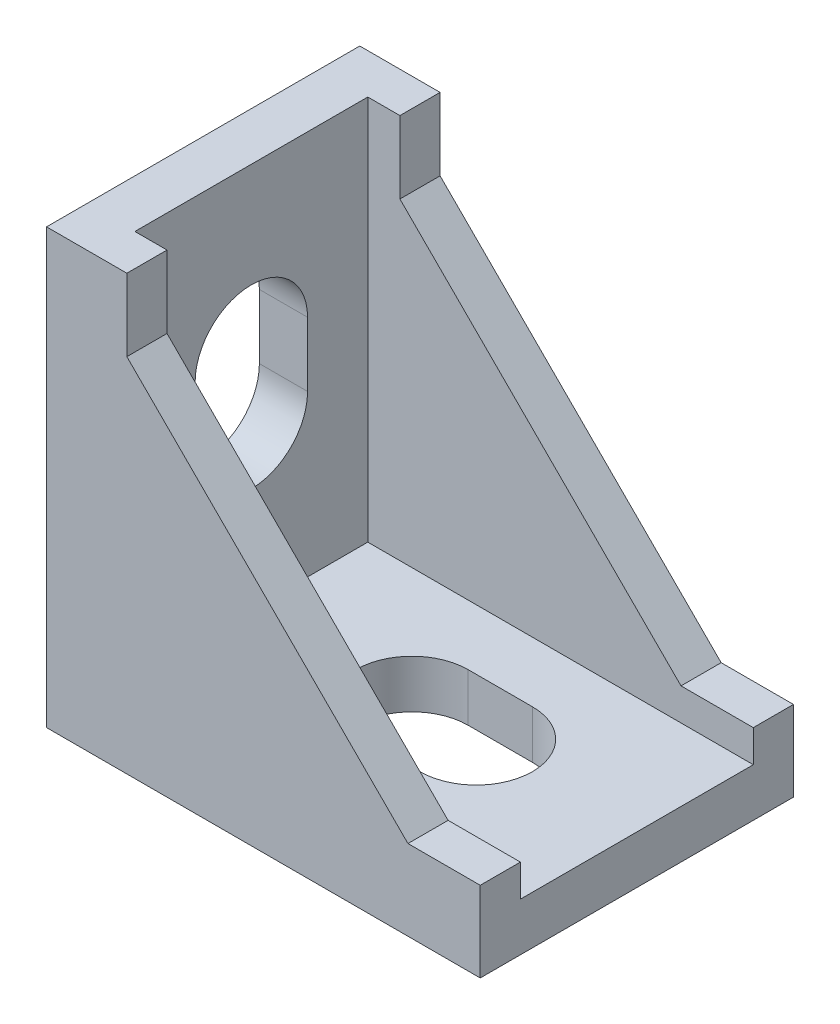
ISO-10303-21;
HEADER;
FILE_DESCRIPTION(('STEP AP214'),'2;1');
FILE_NAME('part.step','',(''),(''),'','','');
FILE_SCHEMA(('AUTOMOTIVE_DESIGN { 1 0 10303 214 1 1 1 1 }'));
ENDSEC;
DATA;
#1=APPLICATION_CONTEXT('core data for automotive mechanical design processes');
#2=APPLICATION_PROTOCOL_DEFINITION('international standard','automotive_design',2000,#1);
#3=PRODUCT_CONTEXT('',#1,'mechanical');
#4=PRODUCT('Part','Part','',(#3));
#5=PRODUCT_RELATED_PRODUCT_CATEGORY('part','',(#4));
#6=PRODUCT_DEFINITION_FORMATION('','',#4);
#7=PRODUCT_DEFINITION_CONTEXT('part definition',#1,'design');
#8=PRODUCT_DEFINITION('design','',#6,#7);
#9=PRODUCT_DEFINITION_SHAPE('','',#8);
#10=(LENGTH_UNIT() NAMED_UNIT(*) SI_UNIT(.MILLI.,.METRE.));
#11=(NAMED_UNIT(*) PLANE_ANGLE_UNIT() SI_UNIT($,.RADIAN.));
#12=(NAMED_UNIT(*) SI_UNIT($,.STERADIAN.) SOLID_ANGLE_UNIT());
#13=UNCERTAINTY_MEASURE_WITH_UNIT(LENGTH_MEASURE(1.E-05),#10,'distance_accuracy_value','');
#14=(GEOMETRIC_REPRESENTATION_CONTEXT(3) GLOBAL_UNCERTAINTY_ASSIGNED_CONTEXT((#13)) GLOBAL_UNIT_ASSIGNED_CONTEXT((#10,
#11,#12)) REPRESENTATION_CONTEXT('',''));
#15=CARTESIAN_POINT('',(0.,0.,0.));
#16=DIRECTION('',(0.,0.,1.));
#17=DIRECTION('',(1.,0.,0.));
#18=AXIS2_PLACEMENT_3D('',#15,#16,#17);
#19=CARTESIAN_POINT('',(27.,5.,19.5));
#20=DIRECTION('',(-1.,0.,0.));
#21=DIRECTION('',(0.,0.,1.));
#22=AXIS2_PLACEMENT_3D('',#19,#20,#21);
#23=PLANE('',#22);
#24=DIRECTION('',(0.,1.,0.));
#25=VECTOR('',#24,1.);
#26=CARTESIAN_POINT('',(27.,3.,2.5));
#27=LINE('',#26,#25);
#28=CARTESIAN_POINT('',(27.,3.,2.5));
#29=VERTEX_POINT('',#28);
#30=CARTESIAN_POINT('',(27.,5.,2.5));
#31=VERTEX_POINT('',#30);
#32=EDGE_CURVE('E264',#29,#31,#27,.T.);
#33=ORIENTED_EDGE('',*,*,#32,.F.);
#34=DIRECTION('',(0.,0.,1.));
#35=VECTOR('',#34,1.);
#36=CARTESIAN_POINT('',(27.,3.,2.5));
#37=LINE('',#36,#35);
#38=CARTESIAN_POINT('',(27.,3.,17.));
#39=VERTEX_POINT('',#38);
#40=EDGE_CURVE('E299',#29,#39,#37,.T.);
#41=ORIENTED_EDGE('',*,*,#40,.T.);
#42=DIRECTION('',(0.,1.,0.));
#43=VECTOR('',#42,1.);
#44=CARTESIAN_POINT('',(27.,3.,17.));
#45=LINE('',#44,#43);
#46=CARTESIAN_POINT('',(27.,5.,17.));
#47=VERTEX_POINT('',#46);
#48=EDGE_CURVE('E281',#39,#47,#45,.T.);
#49=ORIENTED_EDGE('',*,*,#48,.T.);
#50=DIRECTION('',(0.,0.,-1.));
#51=VECTOR('',#50,1.);
#52=CARTESIAN_POINT('',(27.,5.,19.5));
#53=LINE('',#52,#51);
#54=CARTESIAN_POINT('',(27.,5.,19.5));
#55=VERTEX_POINT('',#54);
#56=EDGE_CURVE('E47',#55,#47,#53,.T.);
#57=ORIENTED_EDGE('',*,*,#56,.F.);
#58=DIRECTION('',(0.,1.,0.));
#59=VECTOR('',#58,1.);
#60=CARTESIAN_POINT('',(27.,5.,19.5));
#61=LINE('',#60,#59);
#62=CARTESIAN_POINT('',(27.,0.,19.5));
#63=VERTEX_POINT('',#62);
#64=EDGE_CURVE('E306',#63,#55,#61,.T.);
#65=ORIENTED_EDGE('',*,*,#64,.F.);
#66=DIRECTION('',(0.,0.,-1.));
#67=VECTOR('',#66,1.);
#68=CARTESIAN_POINT('',(27.,0.,19.5));
#69=LINE('',#68,#67);
#70=CARTESIAN_POINT('',(27.,0.,0.));
#71=VERTEX_POINT('',#70);
#72=EDGE_CURVE('E11',#63,#71,#69,.T.);
#73=ORIENTED_EDGE('',*,*,#72,.T.);
#74=DIRECTION('',(0.,1.,0.));
#75=VECTOR('',#74,1.);
#76=CARTESIAN_POINT('',(27.,5.,0.));
#77=LINE('',#76,#75);
#78=CARTESIAN_POINT('',(27.,5.,0.));
#79=VERTEX_POINT('',#78);
#80=EDGE_CURVE('E322',#71,#79,#77,.T.);
#81=ORIENTED_EDGE('',*,*,#80,.T.);
#82=EDGE_CURVE('E353',#31,#79,#53,.T.);
#83=ORIENTED_EDGE('',*,*,#82,.F.);
#84=EDGE_LOOP('',(#33,#41,#49,#57,#65,#73,#81,#83));
#85=FACE_BOUND('',#84,.T.);
#86=ADVANCED_FACE('F39',(#85),#23,.F.);
#87=CARTESIAN_POINT('',(22.5,5.,19.5));
#88=DIRECTION('',(0.,-1.,0.));
#89=DIRECTION('',(0.,0.,-1.));
#90=AXIS2_PLACEMENT_3D('',#87,#88,#89);
#91=PLANE('',#90);
#92=DIRECTION('',(-1.,0.,0.));
#93=VECTOR('',#92,1.);
#94=CARTESIAN_POINT('',(22.5,5.,2.5));
#95=LINE('',#94,#93);
#96=CARTESIAN_POINT('',(22.5,5.,2.5));
#97=VERTEX_POINT('',#96);
#98=EDGE_CURVE('E266',#31,#97,#95,.T.);
#99=ORIENTED_EDGE('',*,*,#98,.F.);
#100=ORIENTED_EDGE('',*,*,#82,.T.);
#101=DIRECTION('',(-1.,0.,0.));
#102=VECTOR('',#101,1.);
#103=CARTESIAN_POINT('',(22.5,5.,0.));
#104=LINE('',#103,#102);
#105=CARTESIAN_POINT('',(22.5,5.,0.));
#106=VERTEX_POINT('',#105);
#107=EDGE_CURVE('E325',#79,#106,#104,.T.);
#108=ORIENTED_EDGE('',*,*,#107,.T.);
#109=DIRECTION('',(0.,0.,-1.));
#110=VECTOR('',#109,1.);
#111=CARTESIAN_POINT('',(22.5,5.,19.5));
#112=LINE('',#111,#110);
#113=EDGE_CURVE('E350',#97,#106,#112,.T.);
#114=ORIENTED_EDGE('',*,*,#113,.F.);
#115=EDGE_LOOP('',(#99,#100,#108,#114));
#116=FACE_BOUND('',#115,.T.);
#117=ADVANCED_FACE('F361',(#116),#91,.F.);
#118=CARTESIAN_POINT('',(5.,22.5,19.5));
#119=DIRECTION('',(-0.707106781186548,-0.707106781186548,0.));
#120=DIRECTION('',(0.707106781186548,-0.707106781186548,0.));
#121=AXIS2_PLACEMENT_3D('',#118,#119,#120);
#122=PLANE('',#121);
#123=DIRECTION('',(-0.707106781186548,0.707106781186548,0.));
#124=VECTOR('',#123,1.);
#125=CARTESIAN_POINT('',(5.,22.5,2.5));
#126=LINE('',#125,#124);
#127=CARTESIAN_POINT('',(5.,22.5,2.5));
#128=VERTEX_POINT('',#127);
#129=EDGE_CURVE('E268',#97,#128,#126,.T.);
#130=ORIENTED_EDGE('',*,*,#129,.F.);
#131=ORIENTED_EDGE('',*,*,#113,.T.);
#132=DIRECTION('',(-0.707106781186548,0.707106781186548,0.));
#133=VECTOR('',#132,1.);
#134=CARTESIAN_POINT('',(5.,22.5,0.));
#135=LINE('',#134,#133);
#136=CARTESIAN_POINT('',(5.,22.5,0.));
#137=VERTEX_POINT('',#136);
#138=EDGE_CURVE('E328',#106,#137,#135,.T.);
#139=ORIENTED_EDGE('',*,*,#138,.T.);
#140=DIRECTION('',(0.,0.,-1.));
#141=VECTOR('',#140,1.);
#142=CARTESIAN_POINT('',(5.,22.5,19.5));
#143=LINE('',#142,#141);
#144=EDGE_CURVE('E346',#128,#137,#143,.T.);
#145=ORIENTED_EDGE('',*,*,#144,.F.);
#146=EDGE_LOOP('',(#130,#131,#139,#145));
#147=FACE_BOUND('',#146,.T.);
#148=ADVANCED_FACE('F376',(#147),#122,.F.);
#149=CARTESIAN_POINT('',(5.,27.,19.5));
#150=DIRECTION('',(-1.,0.,0.));
#151=DIRECTION('',(0.,-1.,0.));
#152=AXIS2_PLACEMENT_3D('',#149,#150,#151);
#153=PLANE('',#152);
#154=DIRECTION('',(0.,1.,0.));
#155=VECTOR('',#154,1.);
#156=CARTESIAN_POINT('',(5.,27.,2.5));
#157=LINE('',#156,#155);
#158=CARTESIAN_POINT('',(5.,27.,2.5));
#159=VERTEX_POINT('',#158);
#160=EDGE_CURVE('E270',#128,#159,#157,.T.);
#161=ORIENTED_EDGE('',*,*,#160,.F.);
#162=ORIENTED_EDGE('',*,*,#144,.T.);
#163=DIRECTION('',(0.,1.,0.));
#164=VECTOR('',#163,1.);
#165=CARTESIAN_POINT('',(5.,27.,0.));
#166=LINE('',#165,#164);
#167=CARTESIAN_POINT('',(5.,27.,0.));
#168=VERTEX_POINT('',#167);
#169=EDGE_CURVE('E331',#137,#168,#166,.T.);
#170=ORIENTED_EDGE('',*,*,#169,.T.);
#171=DIRECTION('',(0.,0.,-1.));
#172=VECTOR('',#171,1.);
#173=CARTESIAN_POINT('',(5.,27.,19.5));
#174=LINE('',#173,#172);
#175=EDGE_CURVE('E342',#159,#168,#174,.T.);
#176=ORIENTED_EDGE('',*,*,#175,.F.);
#177=EDGE_LOOP('',(#161,#162,#170,#176));
#178=FACE_BOUND('',#177,.T.);
#179=ADVANCED_FACE('F383',(#178),#153,.F.);
#180=CARTESIAN_POINT('',(0.,27.,19.5));
#181=DIRECTION('',(0.,-1.,0.));
#182=DIRECTION('',(0.,0.,-1.));
#183=AXIS2_PLACEMENT_3D('',#180,#181,#182);
#184=PLANE('',#183);
#185=DIRECTION('',(-1.,0.,0.));
#186=VECTOR('',#185,1.);
#187=CARTESIAN_POINT('',(3.,27.,2.5));
#188=LINE('',#187,#186);
#189=CARTESIAN_POINT('',(3.,27.,2.5));
#190=VERTEX_POINT('',#189);
#191=EDGE_CURVE('E272',#159,#190,#188,.T.);
#192=ORIENTED_EDGE('',*,*,#191,.F.);
#193=ORIENTED_EDGE('',*,*,#175,.T.);
#194=DIRECTION('',(-1.,0.,0.));
#195=VECTOR('',#194,1.);
#196=CARTESIAN_POINT('',(0.,27.,0.));
#197=LINE('',#196,#195);
#198=CARTESIAN_POINT('',(0.,27.,0.));
#199=VERTEX_POINT('',#198);
#200=EDGE_CURVE('E334',#168,#199,#197,.T.);
#201=ORIENTED_EDGE('',*,*,#200,.T.);
#202=DIRECTION('',(0.,0.,-1.));
#203=VECTOR('',#202,1.);
#204=CARTESIAN_POINT('',(0.,27.,19.5));
#205=LINE('',#204,#203);
#206=CARTESIAN_POINT('',(0.,27.,19.5));
#207=VERTEX_POINT('',#206);
#208=EDGE_CURVE('E339',#207,#199,#205,.T.);
#209=ORIENTED_EDGE('',*,*,#208,.F.);
#210=DIRECTION('',(-1.,0.,0.));
#211=VECTOR('',#210,1.);
#212=CARTESIAN_POINT('',(0.,27.,19.5));
#213=LINE('',#212,#211);
#214=CARTESIAN_POINT('',(5.,27.,19.5));
#215=VERTEX_POINT('',#214);
#216=EDGE_CURVE('E315',#215,#207,#213,.T.);
#217=ORIENTED_EDGE('',*,*,#216,.F.);
#218=CARTESIAN_POINT('',(5.,27.,17.));
#219=VERTEX_POINT('',#218);
#220=EDGE_CURVE('E343',#215,#219,#174,.T.);
#221=ORIENTED_EDGE('',*,*,#220,.T.);
#222=DIRECTION('',(-1.,0.,0.));
#223=VECTOR('',#222,1.);
#224=CARTESIAN_POINT('',(3.,27.,17.));
#225=LINE('',#224,#223);
#226=CARTESIAN_POINT('',(3.,27.,17.));
#227=VERTEX_POINT('',#226);
#228=EDGE_CURVE('E261',#219,#227,#225,.T.);
#229=ORIENTED_EDGE('',*,*,#228,.T.);
#230=DIRECTION('',(0.,0.,1.));
#231=VECTOR('',#230,1.);
#232=CARTESIAN_POINT('',(3.,27.,2.5));
#233=LINE('',#232,#231);
#234=EDGE_CURVE('E295',#190,#227,#233,.T.);
#235=ORIENTED_EDGE('',*,*,#234,.F.);
#236=EDGE_LOOP('',(#192,#193,#201,#209,#217,#221,#229,#235));
#237=FACE_BOUND('',#236,.T.);
#238=ADVANCED_FACE('F385',(#237),#184,.F.);
#239=CARTESIAN_POINT('',(27.,0.,19.5));
#240=DIRECTION('',(0.,1.,0.));
#241=DIRECTION('',(-1.,0.,0.));
#242=AXIS2_PLACEMENT_3D('',#239,#240,#241);
#243=PLANE('',#242);
#244=DIRECTION('',(-1.,0.,0.));
#245=VECTOR('',#244,1.);
#246=CARTESIAN_POINT('',(13.,0.,6.25));
#247=LINE('',#246,#245);
#248=CARTESIAN_POINT('',(17.,0.,6.25));
#249=VERTEX_POINT('',#248);
#250=CARTESIAN_POINT('',(13.,0.,6.25));
#251=VERTEX_POINT('',#250);
#252=EDGE_CURVE('E235',#249,#251,#247,.T.);
#253=ORIENTED_EDGE('',*,*,#252,.T.);
#254=CARTESIAN_POINT('',(13.,0.,9.75));
#255=DIRECTION('',(0.,1.,0.));
#256=DIRECTION('',(0.,0.,1.));
#257=AXIS2_PLACEMENT_3D('',#254,#255,#256);
#258=CIRCLE('',#257,3.5);
#259=CARTESIAN_POINT('',(13.,0.,13.25));
#260=VERTEX_POINT('',#259);
#261=EDGE_CURVE('E225',#251,#260,#258,.T.);
#262=ORIENTED_EDGE('',*,*,#261,.T.);
#263=DIRECTION('',(1.,0.,0.));
#264=VECTOR('',#263,1.);
#265=CARTESIAN_POINT('',(13.,0.,13.25));
#266=LINE('',#265,#264);
#267=CARTESIAN_POINT('',(17.,0.,13.25));
#268=VERTEX_POINT('',#267);
#269=EDGE_CURVE('E228',#260,#268,#266,.T.);
#270=ORIENTED_EDGE('',*,*,#269,.T.);
#271=CARTESIAN_POINT('',(17.,0.,9.75));
#272=DIRECTION('',(0.,1.,0.));
#273=DIRECTION('',(0.,0.,1.));
#274=AXIS2_PLACEMENT_3D('',#271,#272,#273);
#275=CIRCLE('',#274,3.5);
#276=EDGE_CURVE('E232',#268,#249,#275,.T.);
#277=ORIENTED_EDGE('',*,*,#276,.T.);
#278=EDGE_LOOP('',(#253,#262,#270,#277));
#279=FACE_BOUND('',#278,.T.);
#280=DIRECTION('',(1.,0.,0.));
#281=VECTOR('',#280,1.);
#282=CARTESIAN_POINT('',(27.,0.,0.));
#283=LINE('',#282,#281);
#284=CARTESIAN_POINT('',(0.,0.,0.));
#285=VERTEX_POINT('',#284);
#286=EDGE_CURVE('E298',#285,#71,#283,.T.);
#287=ORIENTED_EDGE('',*,*,#286,.T.);
#288=ORIENTED_EDGE('',*,*,#72,.F.);
#289=DIRECTION('',(1.,0.,0.));
#290=VECTOR('',#289,1.);
#291=CARTESIAN_POINT('',(27.,0.,19.5));
#292=LINE('',#291,#290);
#293=CARTESIAN_POINT('',(0.,0.,19.5));
#294=VERTEX_POINT('',#293);
#295=EDGE_CURVE('E303',#294,#63,#292,.T.);
#296=ORIENTED_EDGE('',*,*,#295,.F.);
#297=DIRECTION('',(0.,0.,-1.));
#298=VECTOR('',#297,1.);
#299=CARTESIAN_POINT('',(0.,0.,19.5));
#300=LINE('',#299,#298);
#301=EDGE_CURVE('E319',#294,#285,#300,.T.);
#302=ORIENTED_EDGE('',*,*,#301,.T.);
#303=EDGE_LOOP('',(#287,#288,#296,#302));
#304=FACE_BOUND('',#303,.T.);
#305=ADVANCED_FACE('F41',(#279,#304),#243,.F.);
#306=ORIENTED_EDGE('',*,*,#56,.T.);
#307=DIRECTION('',(-1.,0.,0.));
#308=VECTOR('',#307,1.);
#309=CARTESIAN_POINT('',(22.5,5.,17.));
#310=LINE('',#309,#308);
#311=CARTESIAN_POINT('',(22.5,5.,17.));
#312=VERTEX_POINT('',#311);
#313=EDGE_CURVE('E284',#47,#312,#310,.T.);
#314=ORIENTED_EDGE('',*,*,#313,.T.);
#315=CARTESIAN_POINT('',(22.5,5.,19.5));
#316=VERTEX_POINT('',#315);
#317=EDGE_CURVE('E351',#316,#312,#112,.T.);
#318=ORIENTED_EDGE('',*,*,#317,.F.);
#319=DIRECTION('',(-1.,0.,0.));
#320=VECTOR('',#319,1.);
#321=CARTESIAN_POINT('',(22.5,5.,19.5));
#322=LINE('',#321,#320);
#323=EDGE_CURVE('E309',#55,#316,#322,.T.);
#324=ORIENTED_EDGE('',*,*,#323,.F.);
#325=EDGE_LOOP('',(#306,#314,#318,#324));
#326=FACE_BOUND('',#325,.T.);
#327=ADVANCED_FACE('F397',(#326),#91,.F.);
#328=ORIENTED_EDGE('',*,*,#317,.T.);
#329=DIRECTION('',(-0.707106781186548,0.707106781186548,0.));
#330=VECTOR('',#329,1.);
#331=CARTESIAN_POINT('',(5.,22.5,17.));
#332=LINE('',#331,#330);
#333=CARTESIAN_POINT('',(5.,22.5,17.));
#334=VERTEX_POINT('',#333);
#335=EDGE_CURVE('E287',#312,#334,#332,.T.);
#336=ORIENTED_EDGE('',*,*,#335,.T.);
#337=CARTESIAN_POINT('',(5.,22.5,19.5));
#338=VERTEX_POINT('',#337);
#339=EDGE_CURVE('E347',#338,#334,#143,.T.);
#340=ORIENTED_EDGE('',*,*,#339,.F.);
#341=DIRECTION('',(-0.707106781186548,0.707106781186548,0.));
#342=VECTOR('',#341,1.);
#343=CARTESIAN_POINT('',(5.,22.5,19.5));
#344=LINE('',#343,#342);
#345=EDGE_CURVE('E311',#316,#338,#344,.T.);
#346=ORIENTED_EDGE('',*,*,#345,.F.);
#347=EDGE_LOOP('',(#328,#336,#340,#346));
#348=FACE_BOUND('',#347,.T.);
#349=ADVANCED_FACE('F400',(#348),#122,.F.);
#350=ORIENTED_EDGE('',*,*,#339,.T.);
#351=DIRECTION('',(0.,1.,0.));
#352=VECTOR('',#351,1.);
#353=CARTESIAN_POINT('',(5.,27.,17.));
#354=LINE('',#353,#352);
#355=EDGE_CURVE('E290',#334,#219,#354,.T.);
#356=ORIENTED_EDGE('',*,*,#355,.T.);
#357=ORIENTED_EDGE('',*,*,#220,.F.);
#358=DIRECTION('',(0.,1.,0.));
#359=VECTOR('',#358,1.);
#360=CARTESIAN_POINT('',(5.,27.,19.5));
#361=LINE('',#360,#359);
#362=EDGE_CURVE('E313',#338,#215,#361,.T.);
#363=ORIENTED_EDGE('',*,*,#362,.F.);
#364=EDGE_LOOP('',(#350,#356,#357,#363));
#365=FACE_BOUND('',#364,.T.);
#366=ADVANCED_FACE('F413',(#365),#153,.F.);
#367=CARTESIAN_POINT('',(0.,0.,19.5));
#368=DIRECTION('',(1.,0.,0.));
#369=DIRECTION('',(0.,0.,-1.));
#370=AXIS2_PLACEMENT_3D('',#367,#368,#369);
#371=PLANE('',#370);
#372=DIRECTION('',(0.,-1.,0.));
#373=VECTOR('',#372,1.);
#374=CARTESIAN_POINT('',(0.,13.,13.25));
#375=LINE('',#374,#373);
#376=CARTESIAN_POINT('',(0.,17.,13.25));
#377=VERTEX_POINT('',#376);
#378=CARTESIAN_POINT('',(0.,13.,13.25));
#379=VERTEX_POINT('',#378);
#380=EDGE_CURVE('E196',#377,#379,#375,.T.);
#381=ORIENTED_EDGE('',*,*,#380,.T.);
#382=CARTESIAN_POINT('',(0.,13.,9.75));
#383=DIRECTION('',(1.,0.,0.));
#384=DIRECTION('',(0.,1.,0.));
#385=AXIS2_PLACEMENT_3D('',#382,#383,#384);
#386=CIRCLE('',#385,3.5);
#387=CARTESIAN_POINT('',(0.,13.,6.25));
#388=VERTEX_POINT('',#387);
#389=EDGE_CURVE('E190',#379,#388,#386,.T.);
#390=ORIENTED_EDGE('',*,*,#389,.T.);
#391=DIRECTION('',(0.,1.,0.));
#392=VECTOR('',#391,1.);
#393=CARTESIAN_POINT('',(0.,13.,6.25));
#394=LINE('',#393,#392);
#395=CARTESIAN_POINT('',(0.,17.,6.25));
#396=VERTEX_POINT('',#395);
#397=EDGE_CURVE('E199',#388,#396,#394,.T.);
#398=ORIENTED_EDGE('',*,*,#397,.T.);
#399=CARTESIAN_POINT('',(0.,17.,9.75));
#400=DIRECTION('',(1.,0.,0.));
#401=DIRECTION('',(0.,1.,0.));
#402=AXIS2_PLACEMENT_3D('',#399,#400,#401);
#403=CIRCLE('',#402,3.5);
#404=EDGE_CURVE('E54',#396,#377,#403,.T.);
#405=ORIENTED_EDGE('',*,*,#404,.T.);
#406=EDGE_LOOP('',(#381,#390,#398,#405));
#407=FACE_BOUND('',#406,.T.);
#408=DIRECTION('',(0.,-1.,0.));
#409=VECTOR('',#408,1.);
#410=CARTESIAN_POINT('',(0.,0.,0.));
#411=LINE('',#410,#409);
#412=EDGE_CURVE('E307',#199,#285,#411,.T.);
#413=ORIENTED_EDGE('',*,*,#412,.T.);
#414=ORIENTED_EDGE('',*,*,#301,.F.);
#415=DIRECTION('',(0.,-1.,0.));
#416=VECTOR('',#415,1.);
#417=CARTESIAN_POINT('',(0.,0.,19.5));
#418=LINE('',#417,#416);
#419=EDGE_CURVE('E317',#207,#294,#418,.T.);
#420=ORIENTED_EDGE('',*,*,#419,.F.);
#421=ORIENTED_EDGE('',*,*,#208,.T.);
#422=EDGE_LOOP('',(#413,#414,#420,#421));
#423=FACE_BOUND('',#422,.T.);
#424=ADVANCED_FACE('F203',(#407,#423),#371,.F.);
#425=CARTESIAN_POINT('',(0.,0.,19.5));
#426=DIRECTION('',(0.,0.,-1.));
#427=DIRECTION('',(-1.,0.,0.));
#428=AXIS2_PLACEMENT_3D('',#425,#426,#427);
#429=PLANE('',#428);
#430=ORIENTED_EDGE('',*,*,#295,.T.);
#431=ORIENTED_EDGE('',*,*,#64,.T.);
#432=ORIENTED_EDGE('',*,*,#323,.T.);
#433=ORIENTED_EDGE('',*,*,#345,.T.);
#434=ORIENTED_EDGE('',*,*,#362,.T.);
#435=ORIENTED_EDGE('',*,*,#216,.T.);
#436=ORIENTED_EDGE('',*,*,#419,.T.);
#437=EDGE_LOOP('',(#430,#431,#432,#433,#434,#435,#436));
#438=FACE_BOUND('',#437,.T.);
#439=ADVANCED_FACE('F404',(#438),#429,.F.);
#440=CARTESIAN_POINT('',(0.,0.,0.));
#441=DIRECTION('',(0.,0.,-1.));
#442=DIRECTION('',(-1.,0.,0.));
#443=AXIS2_PLACEMENT_3D('',#440,#441,#442);
#444=PLANE('',#443);
#445=ORIENTED_EDGE('',*,*,#286,.F.);
#446=ORIENTED_EDGE('',*,*,#412,.F.);
#447=ORIENTED_EDGE('',*,*,#200,.F.);
#448=ORIENTED_EDGE('',*,*,#169,.F.);
#449=ORIENTED_EDGE('',*,*,#138,.F.);
#450=ORIENTED_EDGE('',*,*,#107,.F.);
#451=ORIENTED_EDGE('',*,*,#80,.F.);
#452=EDGE_LOOP('',(#445,#446,#447,#448,#449,#450,#451));
#453=FACE_BOUND('',#452,.T.);
#454=ADVANCED_FACE('F370',(#453),#444,.T.);
#455=CARTESIAN_POINT('',(3.,27.,2.5));
#456=DIRECTION('',(-1.,0.,0.));
#457=DIRECTION('',(0.,-1.,0.));
#458=AXIS2_PLACEMENT_3D('',#455,#456,#457);
#459=PLANE('',#458);
#460=DIRECTION('',(0.,1.,0.));
#461=VECTOR('',#460,1.);
#462=CARTESIAN_POINT('',(3.,13.,6.25));
#463=LINE('',#462,#461);
#464=CARTESIAN_POINT('',(3.,13.,6.25));
#465=VERTEX_POINT('',#464);
#466=CARTESIAN_POINT('',(3.,17.,6.25));
#467=VERTEX_POINT('',#466);
#468=EDGE_CURVE('E215',#465,#467,#463,.T.);
#469=ORIENTED_EDGE('',*,*,#468,.F.);
#470=CARTESIAN_POINT('',(3.,13.,9.75));
#471=DIRECTION('',(1.,0.,0.));
#472=DIRECTION('',(0.,1.,0.));
#473=AXIS2_PLACEMENT_3D('',#470,#471,#472);
#474=CIRCLE('',#473,3.5);
#475=CARTESIAN_POINT('',(3.,13.,13.25));
#476=VERTEX_POINT('',#475);
#477=EDGE_CURVE('E62',#476,#465,#474,.T.);
#478=ORIENTED_EDGE('',*,*,#477,.F.);
#479=DIRECTION('',(0.,-1.,0.));
#480=VECTOR('',#479,1.);
#481=CARTESIAN_POINT('',(3.,13.,13.25));
#482=LINE('',#481,#480);
#483=CARTESIAN_POINT('',(3.,17.,13.25));
#484=VERTEX_POINT('',#483);
#485=EDGE_CURVE('E206',#484,#476,#482,.T.);
#486=ORIENTED_EDGE('',*,*,#485,.F.);
#487=CARTESIAN_POINT('',(3.,17.,9.75));
#488=DIRECTION('',(1.,0.,0.));
#489=DIRECTION('',(0.,1.,0.));
#490=AXIS2_PLACEMENT_3D('',#487,#488,#489);
#491=CIRCLE('',#490,3.5);
#492=EDGE_CURVE('E209',#467,#484,#491,.T.);
#493=ORIENTED_EDGE('',*,*,#492,.F.);
#494=EDGE_LOOP('',(#469,#478,#486,#493));
#495=FACE_BOUND('',#494,.T.);
#496=DIRECTION('',(0.,-1.,0.));
#497=VECTOR('',#496,1.);
#498=CARTESIAN_POINT('',(3.,27.,17.));
#499=LINE('',#498,#497);
#500=CARTESIAN_POINT('',(3.,3.,17.));
#501=VERTEX_POINT('',#500);
#502=EDGE_CURVE('E250',#227,#501,#499,.T.);
#503=ORIENTED_EDGE('',*,*,#502,.T.);
#504=DIRECTION('',(0.,0.,1.));
#505=VECTOR('',#504,1.);
#506=CARTESIAN_POINT('',(3.,3.,2.5));
#507=LINE('',#506,#505);
#508=CARTESIAN_POINT('',(3.,3.,2.5));
#509=VERTEX_POINT('',#508);
#510=EDGE_CURVE('E275',#509,#501,#507,.T.);
#511=ORIENTED_EDGE('',*,*,#510,.F.);
#512=DIRECTION('',(0.,-1.,0.));
#513=VECTOR('',#512,1.);
#514=CARTESIAN_POINT('',(3.,27.,2.5));
#515=LINE('',#514,#513);
#516=EDGE_CURVE('E257',#190,#509,#515,.T.);
#517=ORIENTED_EDGE('',*,*,#516,.F.);
#518=ORIENTED_EDGE('',*,*,#234,.T.);
#519=EDGE_LOOP('',(#503,#511,#517,#518));
#520=FACE_BOUND('',#519,.T.);
#521=ADVANCED_FACE('F390',(#495,#520),#459,.F.);
#522=CARTESIAN_POINT('',(3.,3.,2.5));
#523=DIRECTION('',(0.,-1.,0.));
#524=DIRECTION('',(0.,0.,-1.));
#525=AXIS2_PLACEMENT_3D('',#522,#523,#524);
#526=PLANE('',#525);
#527=DIRECTION('',(1.,0.,0.));
#528=VECTOR('',#527,1.);
#529=CARTESIAN_POINT('',(13.,3.,13.25));
#530=LINE('',#529,#528);
#531=CARTESIAN_POINT('',(13.,3.,13.25));
#532=VERTEX_POINT('',#531);
#533=CARTESIAN_POINT('',(17.,3.,13.25));
#534=VERTEX_POINT('',#533);
#535=EDGE_CURVE('E240',#532,#534,#530,.T.);
#536=ORIENTED_EDGE('',*,*,#535,.F.);
#537=CARTESIAN_POINT('',(13.,3.,9.75));
#538=DIRECTION('',(0.,1.,0.));
#539=DIRECTION('',(0.,0.,1.));
#540=AXIS2_PLACEMENT_3D('',#537,#538,#539);
#541=CIRCLE('',#540,3.5);
#542=CARTESIAN_POINT('',(13.,3.,6.25));
#543=VERTEX_POINT('',#542);
#544=EDGE_CURVE('E221',#543,#532,#541,.T.);
#545=ORIENTED_EDGE('',*,*,#544,.F.);
#546=DIRECTION('',(-1.,0.,0.));
#547=VECTOR('',#546,1.);
#548=CARTESIAN_POINT('',(13.,3.,6.25));
#549=LINE('',#548,#547);
#550=CARTESIAN_POINT('',(17.,3.,6.25));
#551=VERTEX_POINT('',#550);
#552=EDGE_CURVE('E229',#551,#543,#549,.T.);
#553=ORIENTED_EDGE('',*,*,#552,.F.);
#554=CARTESIAN_POINT('',(17.,3.,9.75));
#555=DIRECTION('',(0.,1.,0.));
#556=DIRECTION('',(0.,0.,1.));
#557=AXIS2_PLACEMENT_3D('',#554,#555,#556);
#558=CIRCLE('',#557,3.5);
#559=EDGE_CURVE('E243',#534,#551,#558,.T.);
#560=ORIENTED_EDGE('',*,*,#559,.F.);
#561=EDGE_LOOP('',(#536,#545,#553,#560));
#562=FACE_BOUND('',#561,.T.);
#563=DIRECTION('',(1.,0.,0.));
#564=VECTOR('',#563,1.);
#565=CARTESIAN_POINT('',(3.,3.,17.));
#566=LINE('',#565,#564);
#567=EDGE_CURVE('E278',#501,#39,#566,.T.);
#568=ORIENTED_EDGE('',*,*,#567,.T.);
#569=ORIENTED_EDGE('',*,*,#40,.F.);
#570=DIRECTION('',(1.,0.,0.));
#571=VECTOR('',#570,1.);
#572=CARTESIAN_POINT('',(3.,3.,2.5));
#573=LINE('',#572,#571);
#574=EDGE_CURVE('E260',#509,#29,#573,.T.);
#575=ORIENTED_EDGE('',*,*,#574,.F.);
#576=ORIENTED_EDGE('',*,*,#510,.T.);
#577=EDGE_LOOP('',(#568,#569,#575,#576));
#578=FACE_BOUND('',#577,.T.);
#579=ADVANCED_FACE('F393',(#562,#578),#526,.F.);
#580=CARTESIAN_POINT('',(0.,0.,2.5));
#581=DIRECTION('',(0.,0.,1.));
#582=DIRECTION('',(1.,0.,0.));
#583=AXIS2_PLACEMENT_3D('',#580,#581,#582);
#584=PLANE('',#583);
#585=ORIENTED_EDGE('',*,*,#516,.T.);
#586=ORIENTED_EDGE('',*,*,#574,.T.);
#587=ORIENTED_EDGE('',*,*,#32,.T.);
#588=ORIENTED_EDGE('',*,*,#98,.T.);
#589=ORIENTED_EDGE('',*,*,#129,.T.);
#590=ORIENTED_EDGE('',*,*,#160,.T.);
#591=ORIENTED_EDGE('',*,*,#191,.T.);
#592=EDGE_LOOP('',(#585,#586,#587,#588,#589,#590,#591));
#593=FACE_BOUND('',#592,.T.);
#594=ADVANCED_FACE('F379',(#593),#584,.T.);
#595=CARTESIAN_POINT('',(0.,0.,17.));
#596=DIRECTION('',(0.,0.,1.));
#597=DIRECTION('',(1.,0.,0.));
#598=AXIS2_PLACEMENT_3D('',#595,#596,#597);
#599=PLANE('',#598);
#600=ORIENTED_EDGE('',*,*,#502,.F.);
#601=ORIENTED_EDGE('',*,*,#228,.F.);
#602=ORIENTED_EDGE('',*,*,#355,.F.);
#603=ORIENTED_EDGE('',*,*,#335,.F.);
#604=ORIENTED_EDGE('',*,*,#313,.F.);
#605=ORIENTED_EDGE('',*,*,#48,.F.);
#606=ORIENTED_EDGE('',*,*,#567,.F.);
#607=EDGE_LOOP('',(#600,#601,#602,#603,#604,#605,#606));
#608=FACE_BOUND('',#607,.T.);
#609=ADVANCED_FACE('F395',(#608),#599,.F.);
#610=CARTESIAN_POINT('',(13.,0.,9.75));
#611=DIRECTION('',(0.,1.,0.));
#612=DIRECTION('',(0.,0.,1.));
#613=AXIS2_PLACEMENT_3D('',#610,#611,#612);
#614=CYLINDRICAL_SURFACE('',#613,3.5);
#615=ORIENTED_EDGE('',*,*,#544,.T.);
#616=DIRECTION('',(0.,1.,0.));
#617=VECTOR('',#616,1.);
#618=CARTESIAN_POINT('',(13.,0.,13.25));
#619=LINE('',#618,#617);
#620=EDGE_CURVE('E238',#260,#532,#619,.T.);
#621=ORIENTED_EDGE('',*,*,#620,.F.);
#622=ORIENTED_EDGE('',*,*,#261,.F.);
#623=DIRECTION('',(0.,1.,0.));
#624=VECTOR('',#623,1.);
#625=CARTESIAN_POINT('',(13.,0.,6.25));
#626=LINE('',#625,#624);
#627=EDGE_CURVE('E248',#251,#543,#626,.T.);
#628=ORIENTED_EDGE('',*,*,#627,.T.);
#629=EDGE_LOOP('',(#615,#621,#622,#628));
#630=FACE_BOUND('',#629,.T.);
#631=ADVANCED_FACE('F444',(#630),#614,.F.);
#632=CARTESIAN_POINT('',(13.,0.,6.25));
#633=DIRECTION('',(0.,0.,-1.));
#634=DIRECTION('',(-1.,0.,0.));
#635=AXIS2_PLACEMENT_3D('',#632,#633,#634);
#636=PLANE('',#635);
#637=ORIENTED_EDGE('',*,*,#552,.T.);
#638=ORIENTED_EDGE('',*,*,#627,.F.);
#639=ORIENTED_EDGE('',*,*,#252,.F.);
#640=DIRECTION('',(0.,1.,0.));
#641=VECTOR('',#640,1.);
#642=CARTESIAN_POINT('',(17.,0.,6.25));
#643=LINE('',#642,#641);
#644=EDGE_CURVE('E251',#249,#551,#643,.T.);
#645=ORIENTED_EDGE('',*,*,#644,.T.);
#646=EDGE_LOOP('',(#637,#638,#639,#645));
#647=FACE_BOUND('',#646,.T.);
#648=ADVANCED_FACE('F440',(#647),#636,.F.);
#649=CARTESIAN_POINT('',(17.,0.,9.75));
#650=DIRECTION('',(0.,1.,0.));
#651=DIRECTION('',(0.,0.,1.));
#652=AXIS2_PLACEMENT_3D('',#649,#650,#651);
#653=CYLINDRICAL_SURFACE('',#652,3.5);
#654=ORIENTED_EDGE('',*,*,#559,.T.);
#655=ORIENTED_EDGE('',*,*,#644,.F.);
#656=ORIENTED_EDGE('',*,*,#276,.F.);
#657=DIRECTION('',(0.,1.,0.));
#658=VECTOR('',#657,1.);
#659=CARTESIAN_POINT('',(17.,0.,13.25));
#660=LINE('',#659,#658);
#661=EDGE_CURVE('E253',#268,#534,#660,.T.);
#662=ORIENTED_EDGE('',*,*,#661,.T.);
#663=EDGE_LOOP('',(#654,#655,#656,#662));
#664=FACE_BOUND('',#663,.T.);
#665=ADVANCED_FACE('F452',(#664),#653,.F.);
#666=CARTESIAN_POINT('',(13.,0.,13.25));
#667=DIRECTION('',(0.,0.,1.));
#668=DIRECTION('',(1.,0.,0.));
#669=AXIS2_PLACEMENT_3D('',#666,#667,#668);
#670=PLANE('',#669);
#671=ORIENTED_EDGE('',*,*,#535,.T.);
#672=ORIENTED_EDGE('',*,*,#661,.F.);
#673=ORIENTED_EDGE('',*,*,#269,.F.);
#674=ORIENTED_EDGE('',*,*,#620,.T.);
#675=EDGE_LOOP('',(#671,#672,#673,#674));
#676=FACE_BOUND('',#675,.T.);
#677=ADVANCED_FACE('F449',(#676),#670,.F.);
#678=CARTESIAN_POINT('',(0.,13.,9.75));
#679=DIRECTION('',(1.,0.,0.));
#680=DIRECTION('',(0.,1.,0.));
#681=AXIS2_PLACEMENT_3D('',#678,#679,#680);
#682=CYLINDRICAL_SURFACE('',#681,3.5);
#683=ORIENTED_EDGE('',*,*,#477,.T.);
#684=DIRECTION('',(1.,0.,0.));
#685=VECTOR('',#684,1.);
#686=CARTESIAN_POINT('',(0.,13.,6.25));
#687=LINE('',#686,#685);
#688=EDGE_CURVE('E186',#388,#465,#687,.T.);
#689=ORIENTED_EDGE('',*,*,#688,.F.);
#690=ORIENTED_EDGE('',*,*,#389,.F.);
#691=DIRECTION('',(1.,0.,0.));
#692=VECTOR('',#691,1.);
#693=CARTESIAN_POINT('',(0.,13.,13.25));
#694=LINE('',#693,#692);
#695=EDGE_CURVE('E219',#379,#476,#694,.T.);
#696=ORIENTED_EDGE('',*,*,#695,.T.);
#697=EDGE_LOOP('',(#683,#689,#690,#696));
#698=FACE_BOUND('',#697,.T.);
#699=ADVANCED_FACE('F188',(#698),#682,.F.);
#700=CARTESIAN_POINT('',(0.,13.,13.25));
#701=DIRECTION('',(0.,0.,1.));
#702=DIRECTION('',(1.,0.,0.));
#703=AXIS2_PLACEMENT_3D('',#700,#701,#702);
#704=PLANE('',#703);
#705=ORIENTED_EDGE('',*,*,#485,.T.);
#706=ORIENTED_EDGE('',*,*,#695,.F.);
#707=ORIENTED_EDGE('',*,*,#380,.F.);
#708=DIRECTION('',(1.,0.,0.));
#709=VECTOR('',#708,1.);
#710=CARTESIAN_POINT('',(0.,17.,13.25));
#711=LINE('',#710,#709);
#712=EDGE_CURVE('E222',#377,#484,#711,.T.);
#713=ORIENTED_EDGE('',*,*,#712,.T.);
#714=EDGE_LOOP('',(#705,#706,#707,#713));
#715=FACE_BOUND('',#714,.T.);
#716=ADVANCED_FACE('F491',(#715),#704,.F.);
#717=CARTESIAN_POINT('',(0.,17.,9.75));
#718=DIRECTION('',(1.,0.,0.));
#719=DIRECTION('',(0.,1.,0.));
#720=AXIS2_PLACEMENT_3D('',#717,#718,#719);
#721=CYLINDRICAL_SURFACE('',#720,3.5);
#722=ORIENTED_EDGE('',*,*,#492,.T.);
#723=ORIENTED_EDGE('',*,*,#712,.F.);
#724=ORIENTED_EDGE('',*,*,#404,.F.);
#725=DIRECTION('',(1.,0.,0.));
#726=VECTOR('',#725,1.);
#727=CARTESIAN_POINT('',(0.,17.,6.25));
#728=LINE('',#727,#726);
#729=EDGE_CURVE('E195',#396,#467,#728,.T.);
#730=ORIENTED_EDGE('',*,*,#729,.T.);
#731=EDGE_LOOP('',(#722,#723,#724,#730));
#732=FACE_BOUND('',#731,.T.);
#733=ADVANCED_FACE('F502',(#732),#721,.F.);
#734=CARTESIAN_POINT('',(0.,13.,6.25));
#735=DIRECTION('',(0.,0.,-1.));
#736=DIRECTION('',(0.,1.,0.));
#737=AXIS2_PLACEMENT_3D('',#734,#735,#736);
#738=PLANE('',#737);
#739=ORIENTED_EDGE('',*,*,#468,.T.);
#740=ORIENTED_EDGE('',*,*,#729,.F.);
#741=ORIENTED_EDGE('',*,*,#397,.F.);
#742=ORIENTED_EDGE('',*,*,#688,.T.);
#743=EDGE_LOOP('',(#739,#740,#741,#742));
#744=FACE_BOUND('',#743,.T.);
#745=ADVANCED_FACE('F200',(#744),#738,.F.);
#746=CLOSED_SHELL('',(#86,#117,#148,#179,#238,#305,#327,#349,#366,#424,#439,#454,#521,#579,#594,
#609,#631,#648,#665,#677,#699,#716,#733,#745));
#747=MANIFOLD_SOLID_BREP('B2',#746);
#748=ADVANCED_BREP_SHAPE_REPRESENTATION('',(#18,#747),#14);
#749=SHAPE_DEFINITION_REPRESENTATION(#9,#748);
ENDSEC;
END-ISO-10303-21;
